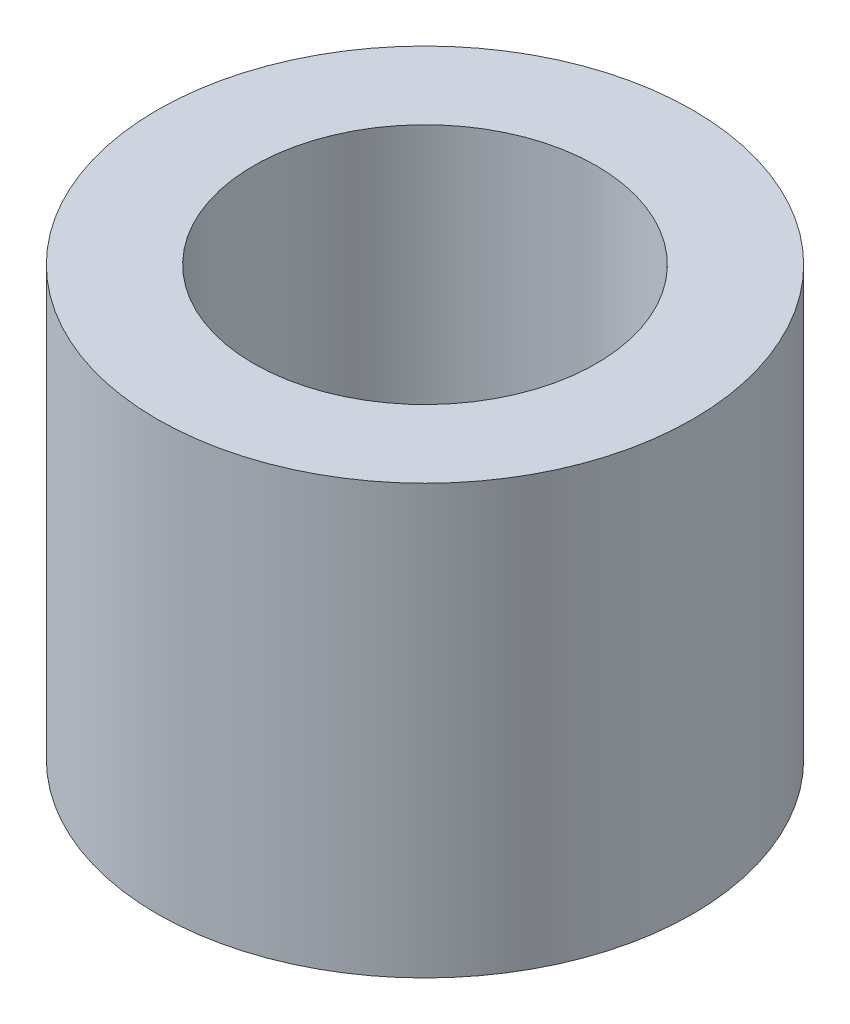
ISO-10303-21;
HEADER;
FILE_DESCRIPTION(('STEP AP214'),'2;1');
FILE_NAME('part.step','',(''),(''),'','','');
FILE_SCHEMA(('AUTOMOTIVE_DESIGN { 1 0 10303 214 1 1 1 1 }'));
ENDSEC;
DATA;
#1=APPLICATION_CONTEXT('core data for automotive mechanical design processes');
#2=APPLICATION_PROTOCOL_DEFINITION('international standard','automotive_design',2000,#1);
#3=PRODUCT_CONTEXT('',#1,'mechanical');
#4=PRODUCT('Part','Part','',(#3));
#5=PRODUCT_RELATED_PRODUCT_CATEGORY('part','',(#4));
#6=PRODUCT_DEFINITION_FORMATION('','',#4);
#7=PRODUCT_DEFINITION_CONTEXT('part definition',#1,'design');
#8=PRODUCT_DEFINITION('design','',#6,#7);
#9=PRODUCT_DEFINITION_SHAPE('','',#8);
#10=(LENGTH_UNIT() NAMED_UNIT(*) SI_UNIT(.MILLI.,.METRE.));
#11=(NAMED_UNIT(*) PLANE_ANGLE_UNIT() SI_UNIT($,.RADIAN.));
#12=(NAMED_UNIT(*) SI_UNIT($,.STERADIAN.) SOLID_ANGLE_UNIT());
#13=UNCERTAINTY_MEASURE_WITH_UNIT(LENGTH_MEASURE(1.E-05),#10,'distance_accuracy_value','');
#14=(GEOMETRIC_REPRESENTATION_CONTEXT(3) GLOBAL_UNCERTAINTY_ASSIGNED_CONTEXT((#13)) GLOBAL_UNIT_ASSIGNED_CONTEXT((#10,
#11,#12)) REPRESENTATION_CONTEXT('',''));
#15=CARTESIAN_POINT('',(0.,0.,0.));
#16=DIRECTION('',(0.,0.,1.));
#17=DIRECTION('',(1.,0.,0.));
#18=AXIS2_PLACEMENT_3D('',#15,#16,#17);
#19=CARTESIAN_POINT('',(0.,4.,0.));
#20=DIRECTION('',(0.,1.,0.));
#21=DIRECTION('',(0.,0.,1.));
#22=AXIS2_PLACEMENT_3D('',#19,#20,#21);
#23=PLANE('',#22);
#24=CARTESIAN_POINT('',(0.,4.,0.));
#25=DIRECTION('',(0.,1.,0.));
#26=DIRECTION('',(0.,0.,1.));
#27=AXIS2_PLACEMENT_3D('',#24,#25,#26);
#28=CIRCLE('',#27,2.5);
#29=CARTESIAN_POINT('',(0.,4.,2.5));
#30=VERTEX_POINT('',#29);
#31=EDGE_CURVE('E10',#30,#30,#28,.T.);
#32=ORIENTED_EDGE('',*,*,#31,.T.);
#33=EDGE_LOOP('',(#32));
#34=FACE_BOUND('',#33,.T.);
#35=CARTESIAN_POINT('',(0.,4.,0.));
#36=DIRECTION('',(0.,1.,0.));
#37=DIRECTION('',(0.,0.,1.));
#38=AXIS2_PLACEMENT_3D('',#35,#36,#37);
#39=CIRCLE('',#38,1.6);
#40=CARTESIAN_POINT('',(0.,4.,1.6));
#41=VERTEX_POINT('',#40);
#42=EDGE_CURVE('E54',#41,#41,#39,.T.);
#43=ORIENTED_EDGE('',*,*,#42,.F.);
#44=EDGE_LOOP('',(#43));
#45=FACE_BOUND('',#44,.T.);
#46=ADVANCED_FACE('F41',(#34,#45),#23,.T.);
#47=CARTESIAN_POINT('',(0.,0.,0.));
#48=DIRECTION('',(0.,1.,0.));
#49=DIRECTION('',(0.,0.,1.));
#50=AXIS2_PLACEMENT_3D('',#47,#48,#49);
#51=PLANE('',#50);
#52=CARTESIAN_POINT('',(0.,0.,0.));
#53=DIRECTION('',(0.,1.,0.));
#54=DIRECTION('',(0.,0.,1.));
#55=AXIS2_PLACEMENT_3D('',#52,#53,#54);
#56=CIRCLE('',#55,2.5);
#57=CARTESIAN_POINT('',(0.,0.,2.5));
#58=VERTEX_POINT('',#57);
#59=EDGE_CURVE('E45',#58,#58,#56,.T.);
#60=ORIENTED_EDGE('',*,*,#59,.F.);
#61=EDGE_LOOP('',(#60));
#62=FACE_BOUND('',#61,.T.);
#63=CARTESIAN_POINT('',(0.,0.,0.));
#64=DIRECTION('',(0.,1.,0.));
#65=DIRECTION('',(0.,0.,1.));
#66=AXIS2_PLACEMENT_3D('',#63,#64,#65);
#67=CIRCLE('',#66,1.6);
#68=CARTESIAN_POINT('',(0.,0.,1.6));
#69=VERTEX_POINT('',#68);
#70=EDGE_CURVE('E56',#69,#69,#67,.T.);
#71=ORIENTED_EDGE('',*,*,#70,.T.);
#72=EDGE_LOOP('',(#71));
#73=FACE_BOUND('',#72,.T.);
#74=ADVANCED_FACE('F68',(#62,#73),#51,.F.);
#75=CARTESIAN_POINT('',(0.,4.,0.));
#76=DIRECTION('',(0.,-1.,0.));
#77=DIRECTION('',(0.,0.,-1.));
#78=AXIS2_PLACEMENT_3D('',#75,#76,#77);
#79=CYLINDRICAL_SURFACE('',#78,2.5);
#80=ORIENTED_EDGE('',*,*,#31,.F.);
#81=EDGE_LOOP('',(#80));
#82=FACE_BOUND('',#81,.T.);
#83=ORIENTED_EDGE('',*,*,#59,.T.);
#84=EDGE_LOOP('',(#83));
#85=FACE_BOUND('',#84,.T.);
#86=ADVANCED_FACE('F43',(#82,#85),#79,.T.);
#87=CARTESIAN_POINT('',(0.,4.,0.));
#88=DIRECTION('',(0.,-1.,0.));
#89=DIRECTION('',(0.,0.,-1.));
#90=AXIS2_PLACEMENT_3D('',#87,#88,#89);
#91=CYLINDRICAL_SURFACE('',#90,1.6);
#92=ORIENTED_EDGE('',*,*,#42,.T.);
#93=EDGE_LOOP('',(#92));
#94=FACE_BOUND('',#93,.T.);
#95=ORIENTED_EDGE('',*,*,#70,.F.);
#96=EDGE_LOOP('',(#95));
#97=FACE_BOUND('',#96,.T.);
#98=ADVANCED_FACE('F64',(#94,#97),#91,.F.);
#99=CLOSED_SHELL('',(#46,#74,#86,#98));
#100=MANIFOLD_SOLID_BREP('B2',#99);
#101=ADVANCED_BREP_SHAPE_REPRESENTATION('',(#18,#100),#14);
#102=SHAPE_DEFINITION_REPRESENTATION(#9,#101);
ENDSEC;
END-ISO-10303-21;
